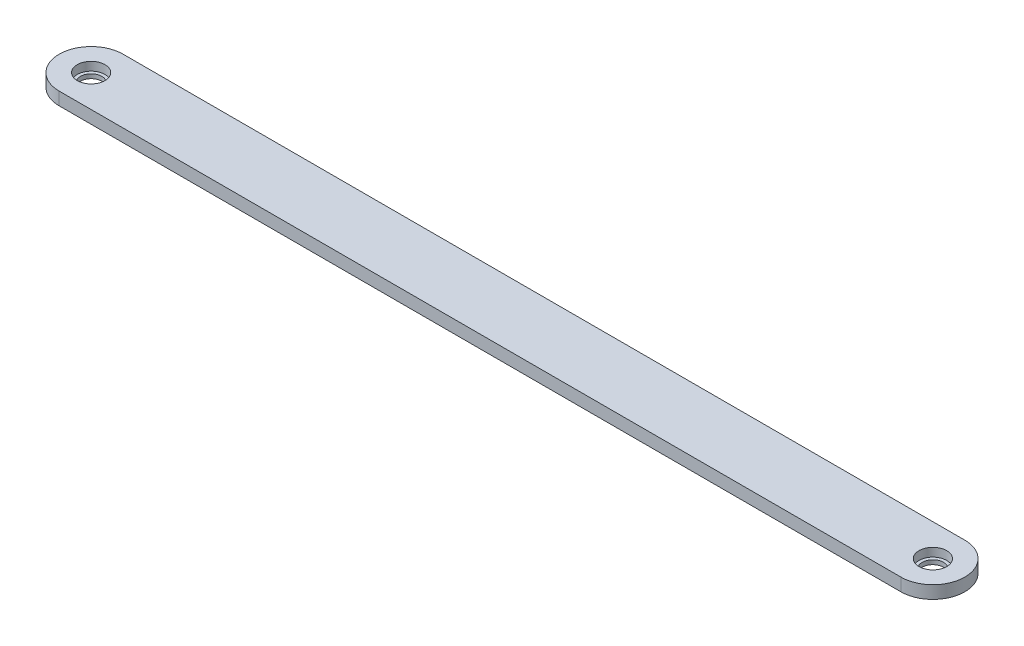
ISO-10303-21;
HEADER;
FILE_DESCRIPTION(('STEP AP214'),'2;1');
FILE_NAME('part.step','',(''),(''),'','','');
FILE_SCHEMA(('AUTOMOTIVE_DESIGN { 1 0 10303 214 1 1 1 1 }'));
ENDSEC;
DATA;
#1=APPLICATION_CONTEXT('core data for automotive mechanical design processes');
#2=APPLICATION_PROTOCOL_DEFINITION('international standard','automotive_design',2000,#1);
#3=PRODUCT_CONTEXT('',#1,'mechanical');
#4=PRODUCT('Part','Part','',(#3));
#5=PRODUCT_RELATED_PRODUCT_CATEGORY('part','',(#4));
#6=PRODUCT_DEFINITION_FORMATION('','',#4);
#7=PRODUCT_DEFINITION_CONTEXT('part definition',#1,'design');
#8=PRODUCT_DEFINITION('design','',#6,#7);
#9=PRODUCT_DEFINITION_SHAPE('','',#8);
#10=(LENGTH_UNIT() NAMED_UNIT(*) SI_UNIT(.MILLI.,.METRE.));
#11=(NAMED_UNIT(*) PLANE_ANGLE_UNIT() SI_UNIT($,.RADIAN.));
#12=(NAMED_UNIT(*) SI_UNIT($,.STERADIAN.) SOLID_ANGLE_UNIT());
#13=UNCERTAINTY_MEASURE_WITH_UNIT(LENGTH_MEASURE(1.E-05),#10,'distance_accuracy_value','');
#14=(GEOMETRIC_REPRESENTATION_CONTEXT(3) GLOBAL_UNCERTAINTY_ASSIGNED_CONTEXT((#13)) GLOBAL_UNIT_ASSIGNED_CONTEXT((#10,
#11,#12)) REPRESENTATION_CONTEXT('',''));
#15=CARTESIAN_POINT('',(0.,0.,0.));
#16=DIRECTION('',(0.,0.,1.));
#17=DIRECTION('',(1.,0.,0.));
#18=AXIS2_PLACEMENT_3D('',#15,#16,#17);
#19=CARTESIAN_POINT('',(-45.,6.,0.));
#20=DIRECTION('',(0.,-1.,0.));
#21=DIRECTION('',(0.,0.,-1.));
#22=AXIS2_PLACEMENT_3D('',#19,#20,#21);
#23=CYLINDRICAL_SURFACE('',#22,5.);
#24=CARTESIAN_POINT('',(-45.,0.,0.));
#25=DIRECTION('',(0.,1.,0.));
#26=DIRECTION('',(0.,0.,1.));
#27=AXIS2_PLACEMENT_3D('',#24,#25,#26);
#28=CIRCLE('',#27,5.);
#29=CARTESIAN_POINT('',(-45.,0.,5.));
#30=VERTEX_POINT('',#29);
#31=EDGE_CURVE('E115',#30,#30,#28,.T.);
#32=ORIENTED_EDGE('',*,*,#31,.F.);
#33=EDGE_LOOP('',(#32));
#34=FACE_BOUND('',#33,.T.);
#35=CARTESIAN_POINT('',(-45.,2.,0.));
#36=DIRECTION('',(0.,1.,0.));
#37=DIRECTION('',(0.,0.,1.));
#38=AXIS2_PLACEMENT_3D('',#35,#36,#37);
#39=CIRCLE('',#38,5.);
#40=CARTESIAN_POINT('',(-45.,2.,5.));
#41=VERTEX_POINT('',#40);
#42=EDGE_CURVE('E43',#41,#41,#39,.T.);
#43=ORIENTED_EDGE('',*,*,#42,.T.);
#44=EDGE_LOOP('',(#43));
#45=FACE_BOUND('',#44,.T.);
#46=ADVANCED_FACE('F39',(#34,#45),#23,.F.);
#47=CARTESIAN_POINT('',(350.,6.,0.));
#48=DIRECTION('',(0.,-1.,0.));
#49=DIRECTION('',(0.,0.,-1.));
#50=AXIS2_PLACEMENT_3D('',#47,#48,#49);
#51=CYLINDRICAL_SURFACE('',#50,4.99999999999999);
#52=CARTESIAN_POINT('',(350.,0.,0.));
#53=DIRECTION('',(0.,1.,0.));
#54=DIRECTION('',(0.,0.,1.));
#55=AXIS2_PLACEMENT_3D('',#52,#53,#54);
#56=CIRCLE('',#55,4.99999999999999);
#57=CARTESIAN_POINT('',(350.,0.,4.99999999999999));
#58=VERTEX_POINT('',#57);
#59=EDGE_CURVE('E134',#58,#58,#56,.T.);
#60=ORIENTED_EDGE('',*,*,#59,.F.);
#61=EDGE_LOOP('',(#60));
#62=FACE_BOUND('',#61,.T.);
#63=CARTESIAN_POINT('',(350.,2.,0.));
#64=DIRECTION('',(0.,1.,0.));
#65=DIRECTION('',(0.,0.,1.));
#66=AXIS2_PLACEMENT_3D('',#63,#64,#65);
#67=CIRCLE('',#66,4.99999999999999);
#68=CARTESIAN_POINT('',(350.,2.,4.99999999999999));
#69=VERTEX_POINT('',#68);
#70=EDGE_CURVE('E125',#69,#69,#67,.T.);
#71=ORIENTED_EDGE('',*,*,#70,.T.);
#72=EDGE_LOOP('',(#71));
#73=FACE_BOUND('',#72,.T.);
#74=ADVANCED_FACE('F165',(#62,#73),#51,.F.);
#75=CARTESIAN_POINT('',(350.,6.,0.));
#76=DIRECTION('',(0.,1.,0.));
#77=DIRECTION('',(0.,0.,1.));
#78=AXIS2_PLACEMENT_3D('',#75,#76,#77);
#79=PLANE('',#78);
#80=CARTESIAN_POINT('',(-45.,6.,0.));
#81=DIRECTION('',(0.,1.,0.));
#82=DIRECTION('',(0.,0.,1.));
#83=AXIS2_PLACEMENT_3D('',#80,#81,#82);
#84=CIRCLE('',#83,6.5);
#85=CARTESIAN_POINT('',(-45.,6.,6.5));
#86=VERTEX_POINT('',#85);
#87=EDGE_CURVE('E136',#86,#86,#84,.T.);
#88=ORIENTED_EDGE('',*,*,#87,.F.);
#89=EDGE_LOOP('',(#88));
#90=FACE_BOUND('',#89,.T.);
#91=CARTESIAN_POINT('',(350.,6.,0.));
#92=DIRECTION('',(0.,1.,0.));
#93=DIRECTION('',(0.,0.,1.));
#94=AXIS2_PLACEMENT_3D('',#91,#92,#93);
#95=CIRCLE('',#94,6.50000000000002);
#96=CARTESIAN_POINT('',(350.,6.,6.50000000000002));
#97=VERTEX_POINT('',#96);
#98=EDGE_CURVE('E148',#97,#97,#95,.T.);
#99=ORIENTED_EDGE('',*,*,#98,.F.);
#100=EDGE_LOOP('',(#99));
#101=FACE_BOUND('',#100,.T.);
#102=CARTESIAN_POINT('',(350.,6.,0.));
#103=DIRECTION('',(0.,1.,0.));
#104=DIRECTION('',(0.,0.,1.));
#105=AXIS2_PLACEMENT_3D('',#102,#103,#104);
#106=CIRCLE('',#105,15.);
#107=CARTESIAN_POINT('',(350.,6.,15.));
#108=VERTEX_POINT('',#107);
#109=CARTESIAN_POINT('',(350.,6.,-15.));
#110=VERTEX_POINT('',#109);
#111=EDGE_CURVE('E94',#108,#110,#106,.T.);
#112=ORIENTED_EDGE('',*,*,#111,.T.);
#113=DIRECTION('',(-1.,0.,0.));
#114=VECTOR('',#113,1.);
#115=CARTESIAN_POINT('',(-45.,6.,-15.));
#116=LINE('',#115,#114);
#117=CARTESIAN_POINT('',(-45.,6.,-15.));
#118=VERTEX_POINT('',#117);
#119=EDGE_CURVE('E89',#110,#118,#116,.T.);
#120=ORIENTED_EDGE('',*,*,#119,.T.);
#121=CARTESIAN_POINT('',(-45.,6.,0.));
#122=DIRECTION('',(0.,1.,0.));
#123=DIRECTION('',(0.,0.,1.));
#124=AXIS2_PLACEMENT_3D('',#121,#122,#123);
#125=CIRCLE('',#124,15.);
#126=CARTESIAN_POINT('',(-45.,6.,15.));
#127=VERTEX_POINT('',#126);
#128=EDGE_CURVE('E92',#118,#127,#125,.T.);
#129=ORIENTED_EDGE('',*,*,#128,.T.);
#130=DIRECTION('',(1.,0.,0.));
#131=VECTOR('',#130,1.);
#132=CARTESIAN_POINT('',(-45.,6.,15.));
#133=LINE('',#132,#131);
#134=EDGE_CURVE('E59',#127,#108,#133,.T.);
#135=ORIENTED_EDGE('',*,*,#134,.T.);
#136=EDGE_LOOP('',(#112,#120,#129,#135));
#137=FACE_BOUND('',#136,.T.);
#138=ADVANCED_FACE('F90',(#90,#101,#137),#79,.T.);
#139=CARTESIAN_POINT('',(350.,0.,0.));
#140=DIRECTION('',(0.,1.,0.));
#141=DIRECTION('',(0.,0.,1.));
#142=AXIS2_PLACEMENT_3D('',#139,#140,#141);
#143=PLANE('',#142);
#144=CARTESIAN_POINT('',(350.,0.,0.));
#145=DIRECTION('',(0.,1.,0.));
#146=DIRECTION('',(0.,0.,1.));
#147=AXIS2_PLACEMENT_3D('',#144,#145,#146);
#148=CIRCLE('',#147,15.);
#149=CARTESIAN_POINT('',(350.,0.,15.));
#150=VERTEX_POINT('',#149);
#151=CARTESIAN_POINT('',(350.,0.,-15.));
#152=VERTEX_POINT('',#151);
#153=EDGE_CURVE('E111',#150,#152,#148,.T.);
#154=ORIENTED_EDGE('',*,*,#153,.F.);
#155=DIRECTION('',(1.,0.,0.));
#156=VECTOR('',#155,1.);
#157=CARTESIAN_POINT('',(-45.,0.,15.));
#158=LINE('',#157,#156);
#159=CARTESIAN_POINT('',(-45.,0.,15.));
#160=VERTEX_POINT('',#159);
#161=EDGE_CURVE('E82',#160,#150,#158,.T.);
#162=ORIENTED_EDGE('',*,*,#161,.F.);
#163=CARTESIAN_POINT('',(-45.,0.,0.));
#164=DIRECTION('',(0.,1.,0.));
#165=DIRECTION('',(0.,0.,1.));
#166=AXIS2_PLACEMENT_3D('',#163,#164,#165);
#167=CIRCLE('',#166,15.);
#168=CARTESIAN_POINT('',(-45.,0.,-15.));
#169=VERTEX_POINT('',#168);
#170=EDGE_CURVE('E76',#169,#160,#167,.T.);
#171=ORIENTED_EDGE('',*,*,#170,.F.);
#172=DIRECTION('',(-1.,0.,0.));
#173=VECTOR('',#172,1.);
#174=CARTESIAN_POINT('',(-45.,0.,-15.));
#175=LINE('',#174,#173);
#176=EDGE_CURVE('E99',#152,#169,#175,.T.);
#177=ORIENTED_EDGE('',*,*,#176,.F.);
#178=EDGE_LOOP('',(#154,#162,#171,#177));
#179=FACE_BOUND('',#178,.T.);
#180=ORIENTED_EDGE('',*,*,#31,.T.);
#181=EDGE_LOOP('',(#180));
#182=FACE_BOUND('',#181,.T.);
#183=ORIENTED_EDGE('',*,*,#59,.T.);
#184=EDGE_LOOP('',(#183));
#185=FACE_BOUND('',#184,.T.);
#186=ADVANCED_FACE('F160',(#179,#182,#185),#143,.F.);
#187=CARTESIAN_POINT('',(350.,6.,0.));
#188=DIRECTION('',(0.,-1.,0.));
#189=DIRECTION('',(0.,0.,-1.));
#190=AXIS2_PLACEMENT_3D('',#187,#188,#189);
#191=CYLINDRICAL_SURFACE('',#190,15.);
#192=ORIENTED_EDGE('',*,*,#153,.T.);
#193=DIRECTION('',(0.,-1.,0.));
#194=VECTOR('',#193,1.);
#195=CARTESIAN_POINT('',(350.,6.,-15.));
#196=LINE('',#195,#194);
#197=EDGE_CURVE('E11',#110,#152,#196,.T.);
#198=ORIENTED_EDGE('',*,*,#197,.F.);
#199=ORIENTED_EDGE('',*,*,#111,.F.);
#200=DIRECTION('',(0.,-1.,0.));
#201=VECTOR('',#200,1.);
#202=CARTESIAN_POINT('',(350.,6.,15.));
#203=LINE('',#202,#201);
#204=EDGE_CURVE('E107',#108,#150,#203,.T.);
#205=ORIENTED_EDGE('',*,*,#204,.T.);
#206=EDGE_LOOP('',(#192,#198,#199,#205));
#207=FACE_BOUND('',#206,.T.);
#208=ADVANCED_FACE('F41',(#207),#191,.T.);
#209=CARTESIAN_POINT('',(-45.,6.,-15.));
#210=DIRECTION('',(0.,0.,1.));
#211=DIRECTION('',(1.,0.,0.));
#212=AXIS2_PLACEMENT_3D('',#209,#210,#211);
#213=PLANE('',#212);
#214=ORIENTED_EDGE('',*,*,#176,.T.);
#215=DIRECTION('',(0.,-1.,0.));
#216=VECTOR('',#215,1.);
#217=CARTESIAN_POINT('',(-45.,6.,-15.));
#218=LINE('',#217,#216);
#219=EDGE_CURVE('E50',#118,#169,#218,.T.);
#220=ORIENTED_EDGE('',*,*,#219,.F.);
#221=ORIENTED_EDGE('',*,*,#119,.F.);
#222=ORIENTED_EDGE('',*,*,#197,.T.);
#223=EDGE_LOOP('',(#214,#220,#221,#222));
#224=FACE_BOUND('',#223,.T.);
#225=ADVANCED_FACE('F98',(#224),#213,.F.);
#226=CARTESIAN_POINT('',(-45.,6.,0.));
#227=DIRECTION('',(0.,-1.,0.));
#228=DIRECTION('',(0.,0.,-1.));
#229=AXIS2_PLACEMENT_3D('',#226,#227,#228);
#230=CYLINDRICAL_SURFACE('',#229,15.);
#231=ORIENTED_EDGE('',*,*,#170,.T.);
#232=DIRECTION('',(0.,-1.,0.));
#233=VECTOR('',#232,1.);
#234=CARTESIAN_POINT('',(-45.,6.,15.));
#235=LINE('',#234,#233);
#236=EDGE_CURVE('E101',#127,#160,#235,.T.);
#237=ORIENTED_EDGE('',*,*,#236,.F.);
#238=ORIENTED_EDGE('',*,*,#128,.F.);
#239=ORIENTED_EDGE('',*,*,#219,.T.);
#240=EDGE_LOOP('',(#231,#237,#238,#239));
#241=FACE_BOUND('',#240,.T.);
#242=ADVANCED_FACE('F103',(#241),#230,.T.);
#243=CARTESIAN_POINT('',(-45.,6.,15.));
#244=DIRECTION('',(0.,0.,-1.));
#245=DIRECTION('',(-1.,0.,0.));
#246=AXIS2_PLACEMENT_3D('',#243,#244,#245);
#247=PLANE('',#246);
#248=ORIENTED_EDGE('',*,*,#161,.T.);
#249=ORIENTED_EDGE('',*,*,#204,.F.);
#250=ORIENTED_EDGE('',*,*,#134,.F.);
#251=ORIENTED_EDGE('',*,*,#236,.T.);
#252=EDGE_LOOP('',(#248,#249,#250,#251));
#253=FACE_BOUND('',#252,.T.);
#254=ADVANCED_FACE('F186',(#253),#247,.F.);
#255=CARTESIAN_POINT('',(350.,2.,0.));
#256=DIRECTION('',(0.,1.,0.));
#257=DIRECTION('',(0.,0.,1.));
#258=AXIS2_PLACEMENT_3D('',#255,#256,#257);
#259=CYLINDRICAL_SURFACE('',#258,6.50000000000002);
#260=CARTESIAN_POINT('',(350.,2.,0.));
#261=DIRECTION('',(0.,1.,0.));
#262=DIRECTION('',(0.,0.,1.));
#263=AXIS2_PLACEMENT_3D('',#260,#261,#262);
#264=CIRCLE('',#263,6.50000000000002);
#265=CARTESIAN_POINT('',(350.,2.,6.50000000000002));
#266=VERTEX_POINT('',#265);
#267=EDGE_CURVE('E142',#266,#266,#264,.T.);
#268=ORIENTED_EDGE('',*,*,#267,.F.);
#269=EDGE_LOOP('',(#268));
#270=FACE_BOUND('',#269,.T.);
#271=ORIENTED_EDGE('',*,*,#98,.T.);
#272=EDGE_LOOP('',(#271));
#273=FACE_BOUND('',#272,.T.);
#274=ADVANCED_FACE('F182',(#270,#273),#259,.F.);
#275=CARTESIAN_POINT('',(350.,2.,0.));
#276=DIRECTION('',(0.,1.,0.));
#277=DIRECTION('',(0.,0.,1.));
#278=AXIS2_PLACEMENT_3D('',#275,#276,#277);
#279=PLANE('',#278);
#280=ORIENTED_EDGE('',*,*,#70,.F.);
#281=EDGE_LOOP('',(#280));
#282=FACE_BOUND('',#281,.T.);
#283=ORIENTED_EDGE('',*,*,#267,.T.);
#284=EDGE_LOOP('',(#283));
#285=FACE_BOUND('',#284,.T.);
#286=ADVANCED_FACE('F176',(#282,#285),#279,.T.);
#287=CARTESIAN_POINT('',(-45.,2.,0.));
#288=DIRECTION('',(0.,1.,0.));
#289=DIRECTION('',(0.,0.,1.));
#290=AXIS2_PLACEMENT_3D('',#287,#288,#289);
#291=CYLINDRICAL_SURFACE('',#290,6.5);
#292=CARTESIAN_POINT('',(-45.,2.,0.));
#293=DIRECTION('',(0.,1.,0.));
#294=DIRECTION('',(0.,0.,1.));
#295=AXIS2_PLACEMENT_3D('',#292,#293,#294);
#296=CIRCLE('',#295,6.5);
#297=CARTESIAN_POINT('',(-45.,2.,6.5));
#298=VERTEX_POINT('',#297);
#299=EDGE_CURVE('E128',#298,#298,#296,.T.);
#300=ORIENTED_EDGE('',*,*,#299,.F.);
#301=EDGE_LOOP('',(#300));
#302=FACE_BOUND('',#301,.T.);
#303=ORIENTED_EDGE('',*,*,#87,.T.);
#304=EDGE_LOOP('',(#303));
#305=FACE_BOUND('',#304,.T.);
#306=ADVANCED_FACE('F171',(#302,#305),#291,.F.);
#307=CARTESIAN_POINT('',(-45.,2.,0.));
#308=DIRECTION('',(0.,1.,0.));
#309=DIRECTION('',(0.,0.,1.));
#310=AXIS2_PLACEMENT_3D('',#307,#308,#309);
#311=PLANE('',#310);
#312=ORIENTED_EDGE('',*,*,#42,.F.);
#313=EDGE_LOOP('',(#312));
#314=FACE_BOUND('',#313,.T.);
#315=ORIENTED_EDGE('',*,*,#299,.T.);
#316=EDGE_LOOP('',(#315));
#317=FACE_BOUND('',#316,.T.);
#318=ADVANCED_FACE('F169',(#314,#317),#311,.T.);
#319=CLOSED_SHELL('',(#46,#74,#138,#186,#208,#225,#242,#254,#274,#286,#306,#318));
#320=MANIFOLD_SOLID_BREP('B2',#319);
#321=ADVANCED_BREP_SHAPE_REPRESENTATION('',(#18,#320),#14);
#322=SHAPE_DEFINITION_REPRESENTATION(#9,#321);
ENDSEC;
END-ISO-10303-21;
